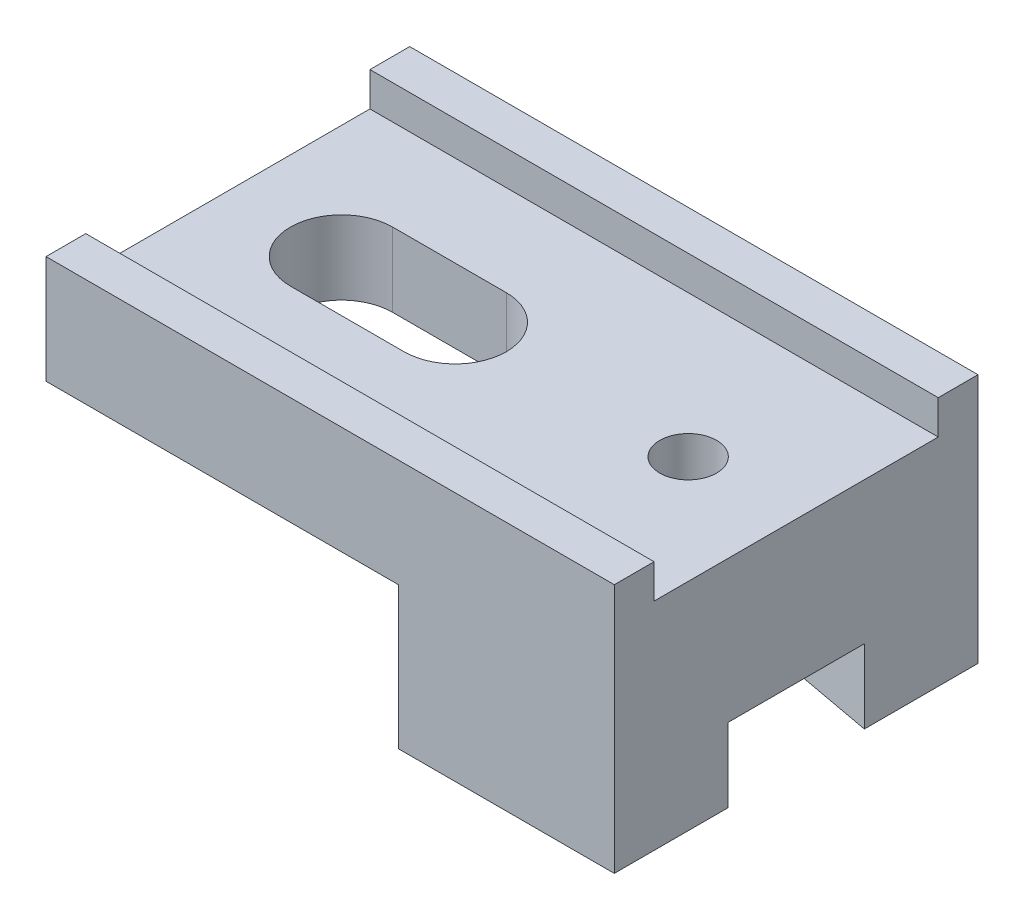
ISO-10303-21;
HEADER;
FILE_DESCRIPTION(('STEP AP214'),'2;1');
FILE_NAME('part.step','',(''),(''),'','','');
FILE_SCHEMA(('AUTOMOTIVE_DESIGN { 1 0 10303 214 1 1 1 1 }'));
ENDSEC;
DATA;
#1=APPLICATION_CONTEXT('core data for automotive mechanical design processes');
#2=APPLICATION_PROTOCOL_DEFINITION('international standard','automotive_design',2000,#1);
#3=PRODUCT_CONTEXT('',#1,'mechanical');
#4=PRODUCT('Part','Part','',(#3));
#5=PRODUCT_RELATED_PRODUCT_CATEGORY('part','',(#4));
#6=PRODUCT_DEFINITION_FORMATION('','',#4);
#7=PRODUCT_DEFINITION_CONTEXT('part definition',#1,'design');
#8=PRODUCT_DEFINITION('design','',#6,#7);
#9=PRODUCT_DEFINITION_SHAPE('','',#8);
#10=(LENGTH_UNIT() NAMED_UNIT(*) SI_UNIT(.MILLI.,.METRE.));
#11=(NAMED_UNIT(*) PLANE_ANGLE_UNIT() SI_UNIT($,.RADIAN.));
#12=(NAMED_UNIT(*) SI_UNIT($,.STERADIAN.) SOLID_ANGLE_UNIT());
#13=UNCERTAINTY_MEASURE_WITH_UNIT(LENGTH_MEASURE(1.E-05),#10,'distance_accuracy_value','');
#14=(GEOMETRIC_REPRESENTATION_CONTEXT(3) GLOBAL_UNCERTAINTY_ASSIGNED_CONTEXT((#13)) GLOBAL_UNIT_ASSIGNED_CONTEXT((#10,
#11,#12)) REPRESENTATION_CONTEXT('',''));
#15=CARTESIAN_POINT('',(0.,0.,0.));
#16=DIRECTION('',(0.,0.,1.));
#17=DIRECTION('',(1.,0.,0.));
#18=AXIS2_PLACEMENT_3D('',#15,#16,#17);
#19=CARTESIAN_POINT('',(0.,-25.,0.));
#20=DIRECTION('',(0.,-1.,0.));
#21=DIRECTION('',(0.,0.,-1.));
#22=AXIS2_PLACEMENT_3D('',#19,#20,#21);
#23=PLANE('',#22);
#24=CARTESIAN_POINT('',(87.,-25.,54.));
#25=DIRECTION('',(0.,-1.,0.));
#26=DIRECTION('',(0.,0.,-1.));
#27=AXIS2_PLACEMENT_3D('',#24,#25,#26);
#28=CIRCLE('',#27,3.00000000000001);
#29=CARTESIAN_POINT('',(87.,-25.,51.));
#30=VERTEX_POINT('',#29);
#31=EDGE_CURVE('E184',#30,#30,#28,.T.);
#32=ORIENTED_EDGE('',*,*,#31,.F.);
#33=EDGE_LOOP('',(#32));
#34=FACE_BOUND('',#33,.T.);
#35=DIRECTION('',(-0.983453188589073,0.,0.181162429476934));
#36=VECTOR('',#35,1.);
#37=CARTESIAN_POINT('',(62.,-25.,51.));
#38=LINE('',#37,#36);
#39=CARTESIAN_POINT('',(100.,-25.,44.));
#40=VERTEX_POINT('',#39);
#41=CARTESIAN_POINT('',(62.,-25.,51.));
#42=VERTEX_POINT('',#41);
#43=EDGE_CURVE('E204',#40,#42,#38,.T.);
#44=ORIENTED_EDGE('',*,*,#43,.F.);
#45=DIRECTION('',(0.,0.,1.));
#46=VECTOR('',#45,1.);
#47=CARTESIAN_POINT('',(100.,-25.,0.));
#48=LINE('',#47,#46);
#49=CARTESIAN_POINT('',(100.,-25.,64.));
#50=VERTEX_POINT('',#49);
#51=EDGE_CURVE('E235',#40,#50,#48,.T.);
#52=ORIENTED_EDGE('',*,*,#51,.T.);
#53=DIRECTION('',(-1.,0.,0.));
#54=VECTOR('',#53,1.);
#55=CARTESIAN_POINT('',(100.,-25.,64.));
#56=LINE('',#55,#54);
#57=CARTESIAN_POINT('',(62.,-25.,64.));
#58=VERTEX_POINT('',#57);
#59=EDGE_CURVE('E234',#50,#58,#56,.T.);
#60=ORIENTED_EDGE('',*,*,#59,.T.);
#61=DIRECTION('',(0.,0.,-1.));
#62=VECTOR('',#61,1.);
#63=CARTESIAN_POINT('',(62.,-25.,64.));
#64=LINE('',#63,#62);
#65=EDGE_CURVE('E238',#58,#42,#64,.T.);
#66=ORIENTED_EDGE('',*,*,#65,.T.);
#67=EDGE_LOOP('',(#44,#52,#60,#66));
#68=FACE_BOUND('',#67,.T.);
#69=ADVANCED_FACE('F33',(#34,#68),#23,.T.);
#70=CARTESIAN_POINT('',(0.,0.,0.));
#71=DIRECTION('',(0.,1.,0.));
#72=DIRECTION('',(0.,0.,1.));
#73=AXIS2_PLACEMENT_3D('',#70,#71,#72);
#74=PLANE('',#73);
#75=DIRECTION('',(-1.,0.,0.));
#76=VECTOR('',#75,1.);
#77=CARTESIAN_POINT('',(40.,0.,41.));
#78=LINE('',#77,#76);
#79=CARTESIAN_POINT('',(40.,0.,41.));
#80=VERTEX_POINT('',#79);
#81=CARTESIAN_POINT('',(20.,0.,41.));
#82=VERTEX_POINT('',#81);
#83=EDGE_CURVE('E170',#80,#82,#78,.T.);
#84=ORIENTED_EDGE('',*,*,#83,.F.);
#85=CARTESIAN_POINT('',(40.,0.,32.));
#86=DIRECTION('',(0.,-1.,0.));
#87=DIRECTION('',(0.,0.,-1.));
#88=AXIS2_PLACEMENT_3D('',#85,#86,#87);
#89=CIRCLE('',#88,9.);
#90=CARTESIAN_POINT('',(40.,0.,23.));
#91=VERTEX_POINT('',#90);
#92=EDGE_CURVE('E48',#91,#80,#89,.T.);
#93=ORIENTED_EDGE('',*,*,#92,.F.);
#94=DIRECTION('',(1.,0.,0.));
#95=VECTOR('',#94,1.);
#96=CARTESIAN_POINT('',(40.,0.,23.));
#97=LINE('',#96,#95);
#98=CARTESIAN_POINT('',(20.,0.,23.));
#99=VERTEX_POINT('',#98);
#100=EDGE_CURVE('E177',#99,#91,#97,.T.);
#101=ORIENTED_EDGE('',*,*,#100,.F.);
#102=CARTESIAN_POINT('',(20.,0.,32.));
#103=DIRECTION('',(0.,-1.,0.));
#104=DIRECTION('',(0.,0.,-1.));
#105=AXIS2_PLACEMENT_3D('',#102,#103,#104);
#106=CIRCLE('',#105,9.);
#107=EDGE_CURVE('E161',#82,#99,#106,.T.);
#108=ORIENTED_EDGE('',*,*,#107,.F.);
#109=EDGE_LOOP('',(#84,#93,#101,#108));
#110=FACE_BOUND('',#109,.T.);
#111=DIRECTION('',(0.,0.,-1.));
#112=VECTOR('',#111,1.);
#113=CARTESIAN_POINT('',(62.,0.,64.));
#114=LINE('',#113,#112);
#115=CARTESIAN_POINT('',(62.,0.,64.));
#116=VERTEX_POINT('',#115);
#117=CARTESIAN_POINT('',(62.,0.,0.));
#118=VERTEX_POINT('',#117);
#119=EDGE_CURVE('E223',#116,#118,#114,.T.);
#120=ORIENTED_EDGE('',*,*,#119,.F.);
#121=DIRECTION('',(1.,0.,0.));
#122=VECTOR('',#121,1.);
#123=CARTESIAN_POINT('',(0.,0.,64.));
#124=LINE('',#123,#122);
#125=CARTESIAN_POINT('',(0.,0.,64.));
#126=VERTEX_POINT('',#125);
#127=EDGE_CURVE('E289',#126,#116,#124,.T.);
#128=ORIENTED_EDGE('',*,*,#127,.F.);
#129=DIRECTION('',(0.,0.,1.));
#130=VECTOR('',#129,1.);
#131=CARTESIAN_POINT('',(0.,0.,0.));
#132=LINE('',#131,#130);
#133=CARTESIAN_POINT('',(0.,0.,0.));
#134=VERTEX_POINT('',#133);
#135=EDGE_CURVE('E271',#134,#126,#132,.T.);
#136=ORIENTED_EDGE('',*,*,#135,.F.);
#137=DIRECTION('',(-1.,0.,0.));
#138=VECTOR('',#137,1.);
#139=CARTESIAN_POINT('',(0.,0.,0.));
#140=LINE('',#139,#138);
#141=EDGE_CURVE('E292',#118,#134,#140,.T.);
#142=ORIENTED_EDGE('',*,*,#141,.F.);
#143=EDGE_LOOP('',(#120,#128,#136,#142));
#144=FACE_BOUND('',#143,.T.);
#145=ADVANCED_FACE('F174',(#110,#144),#74,.F.);
#146=CARTESIAN_POINT('',(0.,19.,0.));
#147=DIRECTION('',(0.,1.,0.));
#148=DIRECTION('',(0.,0.,1.));
#149=AXIS2_PLACEMENT_3D('',#146,#147,#148);
#150=PLANE('',#149);
#151=DIRECTION('',(1.,0.,0.));
#152=VECTOR('',#151,1.);
#153=CARTESIAN_POINT('',(0.,19.,57.));
#154=LINE('',#153,#152);
#155=CARTESIAN_POINT('',(0.,19.,57.));
#156=VERTEX_POINT('',#155);
#157=CARTESIAN_POINT('',(100.,19.,57.));
#158=VERTEX_POINT('',#157);
#159=EDGE_CURVE('E306',#156,#158,#154,.T.);
#160=ORIENTED_EDGE('',*,*,#159,.F.);
#161=DIRECTION('',(0.,0.,1.));
#162=VECTOR('',#161,1.);
#163=CARTESIAN_POINT('',(0.,19.,0.));
#164=LINE('',#163,#162);
#165=CARTESIAN_POINT('',(0.,19.,64.));
#166=VERTEX_POINT('',#165);
#167=EDGE_CURVE('E278',#156,#166,#164,.T.);
#168=ORIENTED_EDGE('',*,*,#167,.T.);
#169=DIRECTION('',(1.,0.,0.));
#170=VECTOR('',#169,1.);
#171=CARTESIAN_POINT('',(0.,19.,64.));
#172=LINE('',#171,#170);
#173=CARTESIAN_POINT('',(100.,19.,64.));
#174=VERTEX_POINT('',#173);
#175=EDGE_CURVE('E277',#166,#174,#172,.T.);
#176=ORIENTED_EDGE('',*,*,#175,.T.);
#177=DIRECTION('',(0.,0.,-1.));
#178=VECTOR('',#177,1.);
#179=CARTESIAN_POINT('',(100.,19.,0.));
#180=LINE('',#179,#178);
#181=EDGE_CURVE('E281',#174,#158,#180,.T.);
#182=ORIENTED_EDGE('',*,*,#181,.T.);
#183=EDGE_LOOP('',(#160,#168,#176,#182));
#184=FACE_BOUND('',#183,.T.);
#185=ADVANCED_FACE('F337',(#184),#150,.T.);
#186=CARTESIAN_POINT('',(0.,19.,0.));
#187=DIRECTION('',(1.,0.,0.));
#188=DIRECTION('',(0.,0.,-1.));
#189=AXIS2_PLACEMENT_3D('',#186,#187,#188);
#190=PLANE('',#189);
#191=ORIENTED_EDGE('',*,*,#167,.F.);
#192=DIRECTION('',(0.,1.,0.));
#193=VECTOR('',#192,1.);
#194=CARTESIAN_POINT('',(0.,24.9136824732483,57.));
#195=LINE('',#194,#193);
#196=CARTESIAN_POINT('',(0.,13.,57.));
#197=VERTEX_POINT('',#196);
#198=EDGE_CURVE('E252',#197,#156,#195,.T.);
#199=ORIENTED_EDGE('',*,*,#198,.F.);
#200=DIRECTION('',(0.,0.,1.));
#201=VECTOR('',#200,1.);
#202=CARTESIAN_POINT('',(0.,13.,57.));
#203=LINE('',#202,#201);
#204=CARTESIAN_POINT('',(0.,13.,7.));
#205=VERTEX_POINT('',#204);
#206=EDGE_CURVE('E257',#205,#197,#203,.T.);
#207=ORIENTED_EDGE('',*,*,#206,.F.);
#208=DIRECTION('',(0.,-1.,0.));
#209=VECTOR('',#208,1.);
#210=CARTESIAN_POINT('',(0.,24.9136824732483,7.));
#211=LINE('',#210,#209);
#212=CARTESIAN_POINT('',(0.,19.,7.));
#213=VERTEX_POINT('',#212);
#214=EDGE_CURVE('E265',#213,#205,#211,.T.);
#215=ORIENTED_EDGE('',*,*,#214,.F.);
#216=CARTESIAN_POINT('',(0.,19.,0.));
#217=VERTEX_POINT('',#216);
#218=EDGE_CURVE('E274',#217,#213,#164,.T.);
#219=ORIENTED_EDGE('',*,*,#218,.F.);
#220=DIRECTION('',(0.,-1.,0.));
#221=VECTOR('',#220,1.);
#222=CARTESIAN_POINT('',(0.,19.,0.));
#223=LINE('',#222,#221);
#224=EDGE_CURVE('E286',#217,#134,#223,.T.);
#225=ORIENTED_EDGE('',*,*,#224,.T.);
#226=ORIENTED_EDGE('',*,*,#135,.T.);
#227=DIRECTION('',(0.,-1.,0.));
#228=VECTOR('',#227,1.);
#229=CARTESIAN_POINT('',(0.,19.,64.));
#230=LINE('',#229,#228);
#231=EDGE_CURVE('E301',#166,#126,#230,.T.);
#232=ORIENTED_EDGE('',*,*,#231,.F.);
#233=EDGE_LOOP('',(#191,#199,#207,#215,#219,#225,#226,#232));
#234=FACE_BOUND('',#233,.T.);
#235=ADVANCED_FACE('F35',(#234),#190,.F.);
#236=CARTESIAN_POINT('',(0.,19.,64.));
#237=DIRECTION('',(0.,0.,-1.));
#238=DIRECTION('',(-1.,0.,0.));
#239=AXIS2_PLACEMENT_3D('',#236,#237,#238);
#240=PLANE('',#239);
#241=ORIENTED_EDGE('',*,*,#127,.T.);
#242=DIRECTION('',(0.,1.,0.));
#243=VECTOR('',#242,1.);
#244=CARTESIAN_POINT('',(62.,-25.,64.));
#245=LINE('',#244,#243);
#246=EDGE_CURVE('E249',#58,#116,#245,.T.);
#247=ORIENTED_EDGE('',*,*,#246,.F.);
#248=ORIENTED_EDGE('',*,*,#59,.F.);
#249=DIRECTION('',(0.,-1.,0.));
#250=VECTOR('',#249,1.);
#251=CARTESIAN_POINT('',(100.,19.,64.));
#252=LINE('',#251,#250);
#253=EDGE_CURVE('E298',#174,#50,#252,.T.);
#254=ORIENTED_EDGE('',*,*,#253,.F.);
#255=ORIENTED_EDGE('',*,*,#175,.F.);
#256=ORIENTED_EDGE('',*,*,#231,.T.);
#257=EDGE_LOOP('',(#241,#247,#248,#254,#255,#256));
#258=FACE_BOUND('',#257,.T.);
#259=ADVANCED_FACE('F383',(#258),#240,.F.);
#260=CARTESIAN_POINT('',(100.,19.,0.));
#261=DIRECTION('',(-1.,0.,0.));
#262=DIRECTION('',(0.,0.,1.));
#263=AXIS2_PLACEMENT_3D('',#260,#261,#262);
#264=PLANE('',#263);
#265=ORIENTED_EDGE('',*,*,#51,.F.);
#266=DIRECTION('',(0.,-1.,0.));
#267=VECTOR('',#266,1.);
#268=CARTESIAN_POINT('',(100.,-12.,44.));
#269=LINE('',#268,#267);
#270=CARTESIAN_POINT('',(100.,-12.,44.));
#271=VERTEX_POINT('',#270);
#272=EDGE_CURVE('E221',#271,#40,#269,.T.);
#273=ORIENTED_EDGE('',*,*,#272,.F.);
#274=DIRECTION('',(0.,0.,1.));
#275=VECTOR('',#274,1.);
#276=CARTESIAN_POINT('',(100.,-12.,44.));
#277=LINE('',#276,#275);
#278=CARTESIAN_POINT('',(100.,-12.,20.));
#279=VERTEX_POINT('',#278);
#280=EDGE_CURVE('E215',#279,#271,#277,.T.);
#281=ORIENTED_EDGE('',*,*,#280,.F.);
#282=DIRECTION('',(0.,-1.,0.));
#283=VECTOR('',#282,1.);
#284=CARTESIAN_POINT('',(100.,-12.,20.));
#285=LINE('',#284,#283);
#286=CARTESIAN_POINT('',(100.,-25.,20.));
#287=VERTEX_POINT('',#286);
#288=EDGE_CURVE('E224',#279,#287,#285,.T.);
#289=ORIENTED_EDGE('',*,*,#288,.T.);
#290=CARTESIAN_POINT('',(100.,-25.,0.));
#291=VERTEX_POINT('',#290);
#292=EDGE_CURVE('E231',#291,#287,#48,.T.);
#293=ORIENTED_EDGE('',*,*,#292,.F.);
#294=DIRECTION('',(0.,-1.,0.));
#295=VECTOR('',#294,1.);
#296=CARTESIAN_POINT('',(100.,19.,0.));
#297=LINE('',#296,#295);
#298=CARTESIAN_POINT('',(100.,19.,0.));
#299=VERTEX_POINT('',#298);
#300=EDGE_CURVE('E296',#299,#291,#297,.T.);
#301=ORIENTED_EDGE('',*,*,#300,.F.);
#302=CARTESIAN_POINT('',(100.,19.,7.));
#303=VERTEX_POINT('',#302);
#304=EDGE_CURVE('E280',#303,#299,#180,.T.);
#305=ORIENTED_EDGE('',*,*,#304,.F.);
#306=DIRECTION('',(0.,-1.,0.));
#307=VECTOR('',#306,1.);
#308=CARTESIAN_POINT('',(100.,24.9136824732483,7.));
#309=LINE('',#308,#307);
#310=CARTESIAN_POINT('',(100.,13.,7.));
#311=VERTEX_POINT('',#310);
#312=EDGE_CURVE('E256',#303,#311,#309,.T.);
#313=ORIENTED_EDGE('',*,*,#312,.T.);
#314=DIRECTION('',(0.,0.,1.));
#315=VECTOR('',#314,1.);
#316=CARTESIAN_POINT('',(100.,13.,57.));
#317=LINE('',#316,#315);
#318=CARTESIAN_POINT('',(100.,13.,57.));
#319=VERTEX_POINT('',#318);
#320=EDGE_CURVE('E260',#311,#319,#317,.T.);
#321=ORIENTED_EDGE('',*,*,#320,.T.);
#322=DIRECTION('',(0.,1.,0.));
#323=VECTOR('',#322,1.);
#324=CARTESIAN_POINT('',(100.,24.9136824732483,57.));
#325=LINE('',#324,#323);
#326=EDGE_CURVE('E253',#319,#158,#325,.T.);
#327=ORIENTED_EDGE('',*,*,#326,.T.);
#328=ORIENTED_EDGE('',*,*,#181,.F.);
#329=ORIENTED_EDGE('',*,*,#253,.T.);
#330=EDGE_LOOP('',(#265,#273,#281,#289,#293,#301,#305,#313,#321,#327,#328,#329));
#331=FACE_BOUND('',#330,.T.);
#332=ADVANCED_FACE('F371',(#331),#264,.F.);
#333=CARTESIAN_POINT('',(0.,19.,0.));
#334=DIRECTION('',(0.,0.,1.));
#335=DIRECTION('',(1.,0.,0.));
#336=AXIS2_PLACEMENT_3D('',#333,#334,#335);
#337=PLANE('',#336);
#338=ORIENTED_EDGE('',*,*,#300,.T.);
#339=DIRECTION('',(1.,0.,0.));
#340=VECTOR('',#339,1.);
#341=CARTESIAN_POINT('',(62.,-25.,0.));
#342=LINE('',#341,#340);
#343=CARTESIAN_POINT('',(62.,-25.,0.));
#344=VERTEX_POINT('',#343);
#345=EDGE_CURVE('E241',#344,#291,#342,.T.);
#346=ORIENTED_EDGE('',*,*,#345,.F.);
#347=DIRECTION('',(0.,1.,0.));
#348=VECTOR('',#347,1.);
#349=CARTESIAN_POINT('',(62.,-25.,0.));
#350=LINE('',#349,#348);
#351=EDGE_CURVE('E244',#344,#118,#350,.T.);
#352=ORIENTED_EDGE('',*,*,#351,.T.);
#353=ORIENTED_EDGE('',*,*,#141,.T.);
#354=ORIENTED_EDGE('',*,*,#224,.F.);
#355=DIRECTION('',(-1.,0.,0.));
#356=VECTOR('',#355,1.);
#357=CARTESIAN_POINT('',(0.,19.,0.));
#358=LINE('',#357,#356);
#359=EDGE_CURVE('E284',#299,#217,#358,.T.);
#360=ORIENTED_EDGE('',*,*,#359,.F.);
#361=EDGE_LOOP('',(#338,#346,#352,#353,#354,#360));
#362=FACE_BOUND('',#361,.T.);
#363=ADVANCED_FACE('F366',(#362),#337,.F.);
#364=DIRECTION('',(-1.,0.,0.));
#365=VECTOR('',#364,1.);
#366=CARTESIAN_POINT('',(0.,19.,7.));
#367=LINE('',#366,#365);
#368=EDGE_CURVE('E304',#303,#213,#367,.T.);
#369=ORIENTED_EDGE('',*,*,#368,.F.);
#370=ORIENTED_EDGE('',*,*,#304,.T.);
#371=ORIENTED_EDGE('',*,*,#359,.T.);
#372=ORIENTED_EDGE('',*,*,#218,.T.);
#373=EDGE_LOOP('',(#369,#370,#371,#372));
#374=FACE_BOUND('',#373,.T.);
#375=ADVANCED_FACE('F395',(#374),#150,.T.);
#376=CARTESIAN_POINT('',(100.,24.9136824732483,57.));
#377=DIRECTION('',(0.,0.,1.));
#378=DIRECTION('',(1.,0.,0.));
#379=AXIS2_PLACEMENT_3D('',#376,#377,#378);
#380=PLANE('',#379);
#381=ORIENTED_EDGE('',*,*,#159,.T.);
#382=ORIENTED_EDGE('',*,*,#326,.F.);
#383=DIRECTION('',(-1.,0.,0.));
#384=VECTOR('',#383,1.);
#385=CARTESIAN_POINT('',(100.,13.,57.));
#386=LINE('',#385,#384);
#387=EDGE_CURVE('E269',#319,#197,#386,.T.);
#388=ORIENTED_EDGE('',*,*,#387,.T.);
#389=ORIENTED_EDGE('',*,*,#198,.T.);
#390=EDGE_LOOP('',(#381,#382,#388,#389));
#391=FACE_BOUND('',#390,.T.);
#392=ADVANCED_FACE('F402',(#391),#380,.F.);
#393=CARTESIAN_POINT('',(100.,13.,57.));
#394=DIRECTION('',(0.,-1.,0.));
#395=DIRECTION('',(0.,0.,-1.));
#396=AXIS2_PLACEMENT_3D('',#393,#394,#395);
#397=PLANE('',#396);
#398=DIRECTION('',(1.,0.,0.));
#399=VECTOR('',#398,1.);
#400=CARTESIAN_POINT('',(100.,13.,23.));
#401=LINE('',#400,#399);
#402=CARTESIAN_POINT('',(20.,13.,23.));
#403=VERTEX_POINT('',#402);
#404=CARTESIAN_POINT('',(40.,13.,23.));
#405=VERTEX_POINT('',#404);
#406=EDGE_CURVE('E41',#403,#405,#401,.T.);
#407=ORIENTED_EDGE('',*,*,#406,.T.);
#408=CARTESIAN_POINT('',(40.,13.,32.));
#409=DIRECTION('',(0.,-1.,0.));
#410=DIRECTION('',(0.,0.,-1.));
#411=AXIS2_PLACEMENT_3D('',#408,#409,#410);
#412=CIRCLE('',#411,9.);
#413=CARTESIAN_POINT('',(40.,13.,41.));
#414=VERTEX_POINT('',#413);
#415=EDGE_CURVE('E11',#405,#414,#412,.T.);
#416=ORIENTED_EDGE('',*,*,#415,.T.);
#417=DIRECTION('',(-1.,0.,0.));
#418=VECTOR('',#417,1.);
#419=CARTESIAN_POINT('',(100.,13.,41.));
#420=LINE('',#419,#418);
#421=CARTESIAN_POINT('',(20.,13.,41.));
#422=VERTEX_POINT('',#421);
#423=EDGE_CURVE('E308',#414,#422,#420,.T.);
#424=ORIENTED_EDGE('',*,*,#423,.T.);
#425=CARTESIAN_POINT('',(20.,13.,32.));
#426=DIRECTION('',(0.,-1.,0.));
#427=DIRECTION('',(0.,0.,-1.));
#428=AXIS2_PLACEMENT_3D('',#425,#426,#427);
#429=CIRCLE('',#428,9.);
#430=EDGE_CURVE('E164',#422,#403,#429,.T.);
#431=ORIENTED_EDGE('',*,*,#430,.T.);
#432=EDGE_LOOP('',(#407,#416,#424,#431));
#433=FACE_BOUND('',#432,.T.);
#434=CARTESIAN_POINT('',(81.,13.,32.));
#435=DIRECTION('',(0.,-1.,0.));
#436=DIRECTION('',(0.,0.,-1.));
#437=AXIS2_PLACEMENT_3D('',#434,#435,#436);
#438=CIRCLE('',#437,5.);
#439=CARTESIAN_POINT('',(81.,13.,27.));
#440=VERTEX_POINT('',#439);
#441=EDGE_CURVE('E201',#440,#440,#438,.T.);
#442=ORIENTED_EDGE('',*,*,#441,.T.);
#443=EDGE_LOOP('',(#442));
#444=FACE_BOUND('',#443,.T.);
#445=ORIENTED_EDGE('',*,*,#206,.T.);
#446=ORIENTED_EDGE('',*,*,#387,.F.);
#447=ORIENTED_EDGE('',*,*,#320,.F.);
#448=DIRECTION('',(-1.,0.,0.));
#449=VECTOR('',#448,1.);
#450=CARTESIAN_POINT('',(100.,13.,7.));
#451=LINE('',#450,#449);
#452=EDGE_CURVE('E263',#311,#205,#451,.T.);
#453=ORIENTED_EDGE('',*,*,#452,.T.);
#454=EDGE_LOOP('',(#445,#446,#447,#453));
#455=FACE_BOUND('',#454,.T.);
#456=ADVANCED_FACE('F312',(#433,#444,#455),#397,.F.);
#457=CARTESIAN_POINT('',(100.,24.9136824732483,7.));
#458=DIRECTION('',(0.,0.,-1.));
#459=DIRECTION('',(0.,1.,0.));
#460=AXIS2_PLACEMENT_3D('',#457,#458,#459);
#461=PLANE('',#460);
#462=ORIENTED_EDGE('',*,*,#368,.T.);
#463=ORIENTED_EDGE('',*,*,#214,.T.);
#464=ORIENTED_EDGE('',*,*,#452,.F.);
#465=ORIENTED_EDGE('',*,*,#312,.F.);
#466=EDGE_LOOP('',(#462,#463,#464,#465));
#467=FACE_BOUND('',#466,.T.);
#468=ADVANCED_FACE('F353',(#467),#461,.F.);
#469=CARTESIAN_POINT('',(62.,-25.,64.));
#470=DIRECTION('',(1.,0.,0.));
#471=DIRECTION('',(0.,0.,-1.));
#472=AXIS2_PLACEMENT_3D('',#469,#470,#471);
#473=PLANE('',#472);
#474=DIRECTION('',(0.,0.,-1.));
#475=VECTOR('',#474,1.);
#476=CARTESIAN_POINT('',(62.,-12.,13.));
#477=LINE('',#476,#475);
#478=CARTESIAN_POINT('',(62.,-12.,51.));
#479=VERTEX_POINT('',#478);
#480=CARTESIAN_POINT('',(62.,-12.,13.));
#481=VERTEX_POINT('',#480);
#482=EDGE_CURVE('E208',#479,#481,#477,.T.);
#483=ORIENTED_EDGE('',*,*,#482,.F.);
#484=DIRECTION('',(0.,-1.,0.));
#485=VECTOR('',#484,1.);
#486=CARTESIAN_POINT('',(62.,-12.,51.));
#487=LINE('',#486,#485);
#488=EDGE_CURVE('E218',#479,#42,#487,.T.);
#489=ORIENTED_EDGE('',*,*,#488,.T.);
#490=ORIENTED_EDGE('',*,*,#65,.F.);
#491=ORIENTED_EDGE('',*,*,#246,.T.);
#492=ORIENTED_EDGE('',*,*,#119,.T.);
#493=ORIENTED_EDGE('',*,*,#351,.F.);
#494=CARTESIAN_POINT('',(62.,-25.,13.));
#495=VERTEX_POINT('',#494);
#496=EDGE_CURVE('E237',#495,#344,#64,.T.);
#497=ORIENTED_EDGE('',*,*,#496,.F.);
#498=DIRECTION('',(0.,-1.,0.));
#499=VECTOR('',#498,1.);
#500=CARTESIAN_POINT('',(62.,-12.,13.));
#501=LINE('',#500,#499);
#502=EDGE_CURVE('E227',#481,#495,#501,.T.);
#503=ORIENTED_EDGE('',*,*,#502,.F.);
#504=EDGE_LOOP('',(#483,#489,#490,#491,#492,#493,#497,#503));
#505=FACE_BOUND('',#504,.T.);
#506=ADVANCED_FACE('F345',(#505),#473,.F.);
#507=CARTESIAN_POINT('',(87.,-25.,10.));
#508=DIRECTION('',(0.,-1.,0.));
#509=DIRECTION('',(0.,0.,-1.));
#510=AXIS2_PLACEMENT_3D('',#507,#508,#509);
#511=CIRCLE('',#510,3.00000000000001);
#512=CARTESIAN_POINT('',(87.,-25.,6.99999999999999));
#513=VERTEX_POINT('',#512);
#514=EDGE_CURVE('E190',#513,#513,#511,.T.);
#515=ORIENTED_EDGE('',*,*,#514,.F.);
#516=EDGE_LOOP('',(#515));
#517=FACE_BOUND('',#516,.T.);
#518=DIRECTION('',(0.983453188589073,0.,0.181162429476935));
#519=VECTOR('',#518,1.);
#520=CARTESIAN_POINT('',(100.,-25.,20.));
#521=LINE('',#520,#519);
#522=EDGE_CURVE('E209',#495,#287,#521,.T.);
#523=ORIENTED_EDGE('',*,*,#522,.F.);
#524=ORIENTED_EDGE('',*,*,#496,.T.);
#525=ORIENTED_EDGE('',*,*,#345,.T.);
#526=ORIENTED_EDGE('',*,*,#292,.T.);
#527=EDGE_LOOP('',(#523,#524,#525,#526));
#528=FACE_BOUND('',#527,.T.);
#529=ADVANCED_FACE('F333',(#517,#528),#23,.T.);
#530=CARTESIAN_POINT('',(62.,-12.,51.));
#531=DIRECTION('',(0.181162429476934,0.,0.983453188589073));
#532=DIRECTION('',(0.983453188589073,0.,-0.181162429476935));
#533=AXIS2_PLACEMENT_3D('',#530,#531,#532);
#534=PLANE('',#533);
#535=ORIENTED_EDGE('',*,*,#43,.T.);
#536=ORIENTED_EDGE('',*,*,#488,.F.);
#537=DIRECTION('',(-0.983453188589073,0.,0.181162429476934));
#538=VECTOR('',#537,1.);
#539=CARTESIAN_POINT('',(62.,-12.,51.));
#540=LINE('',#539,#538);
#541=EDGE_CURVE('E205',#271,#479,#540,.T.);
#542=ORIENTED_EDGE('',*,*,#541,.F.);
#543=ORIENTED_EDGE('',*,*,#272,.T.);
#544=EDGE_LOOP('',(#535,#536,#542,#543));
#545=FACE_BOUND('',#544,.T.);
#546=ADVANCED_FACE('F344',(#545),#534,.F.);
#547=CARTESIAN_POINT('',(100.,-12.,20.));
#548=DIRECTION('',(0.181162429476935,0.,-0.983453188589073));
#549=DIRECTION('',(-0.983453188589073,0.,-0.181162429476935));
#550=AXIS2_PLACEMENT_3D('',#547,#548,#549);
#551=PLANE('',#550);
#552=ORIENTED_EDGE('',*,*,#522,.T.);
#553=ORIENTED_EDGE('',*,*,#288,.F.);
#554=DIRECTION('',(0.983453188589073,0.,0.181162429476935));
#555=VECTOR('',#554,1.);
#556=CARTESIAN_POINT('',(100.,-12.,20.));
#557=LINE('',#556,#555);
#558=EDGE_CURVE('E212',#481,#279,#557,.T.);
#559=ORIENTED_EDGE('',*,*,#558,.F.);
#560=ORIENTED_EDGE('',*,*,#502,.T.);
#561=EDGE_LOOP('',(#552,#553,#559,#560));
#562=FACE_BOUND('',#561,.T.);
#563=ADVANCED_FACE('F351',(#562),#551,.F.);
#564=CARTESIAN_POINT('',(0.,-12.,0.));
#565=DIRECTION('',(0.,1.,0.));
#566=DIRECTION('',(0.,0.,1.));
#567=AXIS2_PLACEMENT_3D('',#564,#565,#566);
#568=PLANE('',#567);
#569=CARTESIAN_POINT('',(81.,-12.,32.));
#570=DIRECTION('',(0.,-1.,0.));
#571=DIRECTION('',(0.,0.,-1.));
#572=AXIS2_PLACEMENT_3D('',#569,#570,#571);
#573=CIRCLE('',#572,5.);
#574=CARTESIAN_POINT('',(81.,-12.,27.));
#575=VERTEX_POINT('',#574);
#576=EDGE_CURVE('E196',#575,#575,#573,.T.);
#577=ORIENTED_EDGE('',*,*,#576,.F.);
#578=EDGE_LOOP('',(#577));
#579=FACE_BOUND('',#578,.T.);
#580=ORIENTED_EDGE('',*,*,#541,.T.);
#581=ORIENTED_EDGE('',*,*,#482,.T.);
#582=ORIENTED_EDGE('',*,*,#558,.T.);
#583=ORIENTED_EDGE('',*,*,#280,.T.);
#584=EDGE_LOOP('',(#580,#581,#582,#583));
#585=FACE_BOUND('',#584,.T.);
#586=ADVANCED_FACE('F376',(#579,#585),#568,.F.);
#587=CARTESIAN_POINT('',(81.,19.,32.));
#588=DIRECTION('',(0.,-1.,0.));
#589=DIRECTION('',(0.,0.,-1.));
#590=AXIS2_PLACEMENT_3D('',#587,#588,#589);
#591=CYLINDRICAL_SURFACE('',#590,5.);
#592=ORIENTED_EDGE('',*,*,#576,.T.);
#593=EDGE_LOOP('',(#592));
#594=FACE_BOUND('',#593,.T.);
#595=ORIENTED_EDGE('',*,*,#441,.F.);
#596=EDGE_LOOP('',(#595));
#597=FACE_BOUND('',#596,.T.);
#598=ADVANCED_FACE('F467',(#594,#597),#591,.F.);
#599=CARTESIAN_POINT('',(87.,-5.,10.));
#600=DIRECTION('',(0.,-1.,0.));
#601=DIRECTION('',(0.,0.,-1.));
#602=AXIS2_PLACEMENT_3D('',#599,#600,#601);
#603=CYLINDRICAL_SURFACE('',#602,3.00000000000001);
#604=CARTESIAN_POINT('',(87.,-5.,10.));
#605=DIRECTION('',(0.,-1.,0.));
#606=DIRECTION('',(0.,0.,-1.));
#607=AXIS2_PLACEMENT_3D('',#604,#605,#606);
#608=CIRCLE('',#607,3.00000000000001);
#609=CARTESIAN_POINT('',(87.,-5.,6.99999999999999));
#610=VERTEX_POINT('',#609);
#611=EDGE_CURVE('E193',#610,#610,#608,.T.);
#612=ORIENTED_EDGE('',*,*,#611,.F.);
#613=EDGE_LOOP('',(#612));
#614=FACE_BOUND('',#613,.T.);
#615=ORIENTED_EDGE('',*,*,#514,.T.);
#616=EDGE_LOOP('',(#615));
#617=FACE_BOUND('',#616,.T.);
#618=ADVANCED_FACE('F476',(#614,#617),#603,.F.);
#619=CARTESIAN_POINT('',(87.,-5.,10.));
#620=DIRECTION('',(0.,-1.,0.));
#621=DIRECTION('',(0.,0.,-1.));
#622=AXIS2_PLACEMENT_3D('',#619,#620,#621);
#623=PLANE('',#622);
#624=ORIENTED_EDGE('',*,*,#611,.T.);
#625=EDGE_LOOP('',(#624));
#626=FACE_BOUND('',#625,.T.);
#627=ADVANCED_FACE('F493',(#626),#623,.T.);
#628=CARTESIAN_POINT('',(87.,-5.,54.));
#629=DIRECTION('',(0.,-1.,0.));
#630=DIRECTION('',(0.,0.,-1.));
#631=AXIS2_PLACEMENT_3D('',#628,#629,#630);
#632=CYLINDRICAL_SURFACE('',#631,3.00000000000001);
#633=CARTESIAN_POINT('',(87.,-5.,54.));
#634=DIRECTION('',(0.,-1.,0.));
#635=DIRECTION('',(0.,0.,-1.));
#636=AXIS2_PLACEMENT_3D('',#633,#634,#635);
#637=CIRCLE('',#636,3.00000000000001);
#638=CARTESIAN_POINT('',(87.,-5.,51.));
#639=VERTEX_POINT('',#638);
#640=EDGE_CURVE('E187',#639,#639,#637,.T.);
#641=ORIENTED_EDGE('',*,*,#640,.F.);
#642=EDGE_LOOP('',(#641));
#643=FACE_BOUND('',#642,.T.);
#644=ORIENTED_EDGE('',*,*,#31,.T.);
#645=EDGE_LOOP('',(#644));
#646=FACE_BOUND('',#645,.T.);
#647=ADVANCED_FACE('F326',(#643,#646),#632,.F.);
#648=CARTESIAN_POINT('',(87.,-5.,54.));
#649=DIRECTION('',(0.,-1.,0.));
#650=DIRECTION('',(0.,0.,-1.));
#651=AXIS2_PLACEMENT_3D('',#648,#649,#650);
#652=PLANE('',#651);
#653=ORIENTED_EDGE('',*,*,#640,.T.);
#654=EDGE_LOOP('',(#653));
#655=FACE_BOUND('',#654,.T.);
#656=ADVANCED_FACE('F319',(#655),#652,.T.);
#657=CARTESIAN_POINT('',(40.,19.,32.));
#658=DIRECTION('',(0.,-1.,0.));
#659=DIRECTION('',(0.,0.,-1.));
#660=AXIS2_PLACEMENT_3D('',#657,#658,#659);
#661=CYLINDRICAL_SURFACE('',#660,9.);
#662=DIRECTION('',(0.,-1.,0.));
#663=VECTOR('',#662,1.);
#664=CARTESIAN_POINT('',(40.,19.,23.));
#665=LINE('',#664,#663);
#666=EDGE_CURVE('E182',#405,#91,#665,.T.);
#667=ORIENTED_EDGE('',*,*,#666,.T.);
#668=ORIENTED_EDGE('',*,*,#92,.T.);
#669=DIRECTION('',(0.,-1.,0.));
#670=VECTOR('',#669,1.);
#671=CARTESIAN_POINT('',(40.,19.,41.));
#672=LINE('',#671,#670);
#673=EDGE_CURVE('E167',#414,#80,#672,.T.);
#674=ORIENTED_EDGE('',*,*,#673,.F.);
#675=ORIENTED_EDGE('',*,*,#415,.F.);
#676=EDGE_LOOP('',(#667,#668,#674,#675));
#677=FACE_BOUND('',#676,.T.);
#678=ADVANCED_FACE('F317',(#677),#661,.F.);
#679=CARTESIAN_POINT('',(40.,19.,23.));
#680=DIRECTION('',(0.,0.,-1.));
#681=DIRECTION('',(-1.,0.,0.));
#682=AXIS2_PLACEMENT_3D('',#679,#680,#681);
#683=PLANE('',#682);
#684=DIRECTION('',(0.,-1.,0.));
#685=VECTOR('',#684,1.);
#686=CARTESIAN_POINT('',(20.,19.,23.));
#687=LINE('',#686,#685);
#688=EDGE_CURVE('E166',#403,#99,#687,.T.);
#689=ORIENTED_EDGE('',*,*,#688,.T.);
#690=ORIENTED_EDGE('',*,*,#100,.T.);
#691=ORIENTED_EDGE('',*,*,#666,.F.);
#692=ORIENTED_EDGE('',*,*,#406,.F.);
#693=EDGE_LOOP('',(#689,#690,#691,#692));
#694=FACE_BOUND('',#693,.T.);
#695=ADVANCED_FACE('F316',(#694),#683,.F.);
#696=CARTESIAN_POINT('',(20.,19.,32.));
#697=DIRECTION('',(0.,-1.,0.));
#698=DIRECTION('',(0.,0.,-1.));
#699=AXIS2_PLACEMENT_3D('',#696,#697,#698);
#700=CYLINDRICAL_SURFACE('',#699,9.);
#701=DIRECTION('',(0.,-1.,0.));
#702=VECTOR('',#701,1.);
#703=CARTESIAN_POINT('',(20.,19.,41.));
#704=LINE('',#703,#702);
#705=EDGE_CURVE('E56',#422,#82,#704,.T.);
#706=ORIENTED_EDGE('',*,*,#705,.T.);
#707=ORIENTED_EDGE('',*,*,#107,.T.);
#708=ORIENTED_EDGE('',*,*,#688,.F.);
#709=ORIENTED_EDGE('',*,*,#430,.F.);
#710=EDGE_LOOP('',(#706,#707,#708,#709));
#711=FACE_BOUND('',#710,.T.);
#712=ADVANCED_FACE('F158',(#711),#700,.F.);
#713=CARTESIAN_POINT('',(40.,19.,41.));
#714=DIRECTION('',(0.,0.,1.));
#715=DIRECTION('',(1.,0.,0.));
#716=AXIS2_PLACEMENT_3D('',#713,#714,#715);
#717=PLANE('',#716);
#718=ORIENTED_EDGE('',*,*,#673,.T.);
#719=ORIENTED_EDGE('',*,*,#83,.T.);
#720=ORIENTED_EDGE('',*,*,#705,.F.);
#721=ORIENTED_EDGE('',*,*,#423,.F.);
#722=EDGE_LOOP('',(#718,#719,#720,#721));
#723=FACE_BOUND('',#722,.T.);
#724=ADVANCED_FACE('F171',(#723),#717,.F.);
#725=CLOSED_SHELL('',(#69,#145,#185,#235,#259,#332,#363,#375,#392,#456,#468,#506,#529,#546,#563,
#586,#598,#618,#627,#647,#656,#678,#695,#712,#724));
#726=MANIFOLD_SOLID_BREP('B2',#725);
#727=ADVANCED_BREP_SHAPE_REPRESENTATION('',(#18,#726),#14);
#728=SHAPE_DEFINITION_REPRESENTATION(#9,#727);
ENDSEC;
END-ISO-10303-21;
